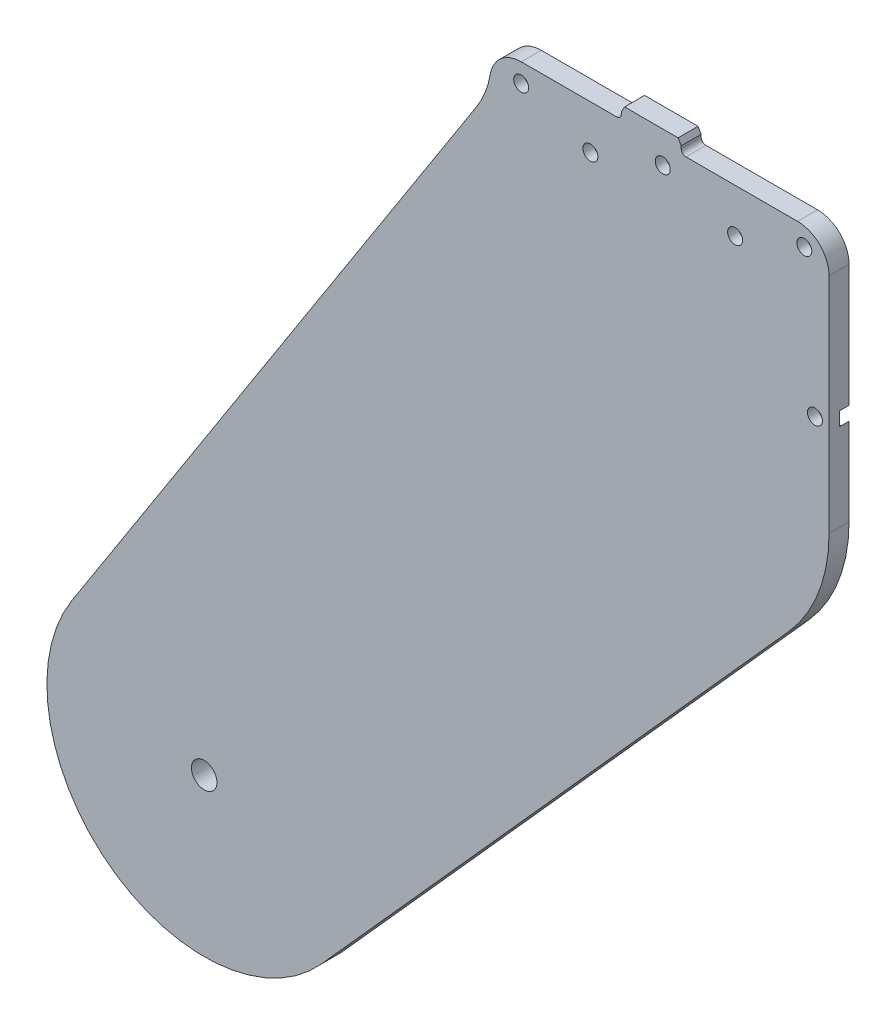
ISO-10303-21;
HEADER;
FILE_DESCRIPTION(('STEP AP214'),'2;1');
FILE_NAME('part.step','',(''),(''),'','','');
FILE_SCHEMA(('AUTOMOTIVE_DESIGN { 1 0 10303 214 1 1 1 1 }'));
ENDSEC;
DATA;
#1=APPLICATION_CONTEXT('core data for automotive mechanical design processes');
#2=APPLICATION_PROTOCOL_DEFINITION('international standard','automotive_design',2000,#1);
#3=PRODUCT_CONTEXT('',#1,'mechanical');
#4=PRODUCT('Part','Part','',(#3));
#5=PRODUCT_RELATED_PRODUCT_CATEGORY('part','',(#4));
#6=PRODUCT_DEFINITION_FORMATION('','',#4);
#7=PRODUCT_DEFINITION_CONTEXT('part definition',#1,'design');
#8=PRODUCT_DEFINITION('design','',#6,#7);
#9=PRODUCT_DEFINITION_SHAPE('','',#8);
#10=(LENGTH_UNIT() NAMED_UNIT(*) SI_UNIT(.MILLI.,.METRE.));
#11=(NAMED_UNIT(*) PLANE_ANGLE_UNIT() SI_UNIT($,.RADIAN.));
#12=(NAMED_UNIT(*) SI_UNIT($,.STERADIAN.) SOLID_ANGLE_UNIT());
#13=UNCERTAINTY_MEASURE_WITH_UNIT(LENGTH_MEASURE(1.E-05),#10,'distance_accuracy_value','');
#14=(GEOMETRIC_REPRESENTATION_CONTEXT(3) GLOBAL_UNCERTAINTY_ASSIGNED_CONTEXT((#13)) GLOBAL_UNIT_ASSIGNED_CONTEXT((#10,
#11,#12)) REPRESENTATION_CONTEXT('',''));
#15=CARTESIAN_POINT('',(0.,0.,0.));
#16=DIRECTION('',(0.,0.,1.));
#17=DIRECTION('',(1.,0.,0.));
#18=AXIS2_PLACEMENT_3D('',#15,#16,#17);
#19=CARTESIAN_POINT('',(0.,0.,0.));
#20=DIRECTION('',(0.,0.,1.));
#21=DIRECTION('',(1.,0.,0.));
#22=AXIS2_PLACEMENT_3D('',#19,#20,#21);
#23=PLANE('',#22);
#24=CARTESIAN_POINT('',(45.75,-46.25,0.));
#25=DIRECTION('',(0.,0.,-1.));
#26=DIRECTION('',(-1.,0.,0.));
#27=AXIS2_PLACEMENT_3D('',#24,#25,#26);
#28=CIRCLE('',#27,4.99999999999999);
#29=CARTESIAN_POINT('',(40.75,-46.25,0.));
#30=VERTEX_POINT('',#29);
#31=EDGE_CURVE('E536',#30,#30,#28,.T.);
#32=ORIENTED_EDGE('',*,*,#31,.F.);
#33=EDGE_LOOP('',(#32));
#34=FACE_BOUND('',#33,.T.);
#35=CARTESIAN_POINT('',(23.75,-54.25,0.));
#36=DIRECTION('',(0.,0.,-1.));
#37=DIRECTION('',(-1.,0.,0.));
#38=AXIS2_PLACEMENT_3D('',#35,#36,#37);
#39=CIRCLE('',#38,4.99999999999999);
#40=CARTESIAN_POINT('',(18.75,-54.25,0.));
#41=VERTEX_POINT('',#40);
#42=EDGE_CURVE('E544',#41,#41,#39,.T.);
#43=ORIENTED_EDGE('',*,*,#42,.F.);
#44=EDGE_LOOP('',(#43));
#45=FACE_BOUND('',#44,.T.);
#46=CARTESIAN_POINT('',(0.750000000000024,-46.25,0.));
#47=DIRECTION('',(0.,0.,-1.));
#48=DIRECTION('',(-1.,0.,0.));
#49=AXIS2_PLACEMENT_3D('',#46,#47,#48);
#50=CIRCLE('',#49,4.99999999999999);
#51=CARTESIAN_POINT('',(-4.24999999999997,-46.25,0.));
#52=VERTEX_POINT('',#51);
#53=EDGE_CURVE('E554',#52,#52,#50,.T.);
#54=ORIENTED_EDGE('',*,*,#53,.F.);
#55=EDGE_LOOP('',(#54));
#56=FACE_BOUND('',#55,.T.);
#57=CARTESIAN_POINT('',(-22.25,-54.25,0.));
#58=DIRECTION('',(0.,0.,-1.));
#59=DIRECTION('',(-1.,0.,0.));
#60=AXIS2_PLACEMENT_3D('',#57,#58,#59);
#61=CIRCLE('',#60,4.99999999999999);
#62=CARTESIAN_POINT('',(-27.25,-54.25,0.));
#63=VERTEX_POINT('',#62);
#64=EDGE_CURVE('E564',#63,#63,#61,.T.);
#65=ORIENTED_EDGE('',*,*,#64,.F.);
#66=EDGE_LOOP('',(#65));
#67=FACE_BOUND('',#66,.T.);
#68=CARTESIAN_POINT('',(-44.25,-46.25,0.));
#69=DIRECTION('',(0.,0.,-1.));
#70=DIRECTION('',(-1.,0.,0.));
#71=AXIS2_PLACEMENT_3D('',#68,#69,#70);
#72=CIRCLE('',#71,4.99999999999999);
#73=CARTESIAN_POINT('',(-49.25,-46.25,0.));
#74=VERTEX_POINT('',#73);
#75=EDGE_CURVE('E574',#74,#74,#72,.T.);
#76=ORIENTED_EDGE('',*,*,#75,.F.);
#77=EDGE_LOOP('',(#76));
#78=FACE_BOUND('',#77,.T.);
#79=CARTESIAN_POINT('',(-145.,-287.,0.));
#80=DIRECTION('',(0.,0.,-1.));
#81=DIRECTION('',(-1.,0.,0.));
#82=AXIS2_PLACEMENT_3D('',#79,#80,#81);
#83=CIRCLE('',#82,4.05);
#84=CARTESIAN_POINT('',(-149.05,-287.,0.));
#85=VERTEX_POINT('',#84);
#86=EDGE_CURVE('E289',#85,#85,#83,.T.);
#87=ORIENTED_EDGE('',*,*,#86,.F.);
#88=EDGE_LOOP('',(#87));
#89=FACE_BOUND('',#88,.T.);
#90=CARTESIAN_POINT('',(49.125,-91.25,0.));
#91=DIRECTION('',(0.,0.,-1.));
#92=DIRECTION('',(-1.,0.,0.));
#93=AXIS2_PLACEMENT_3D('',#90,#91,#92);
#94=CIRCLE('',#93,4.99999999999999);
#95=CARTESIAN_POINT('',(53.625,-93.4294494717704,0.));
#96=VERTEX_POINT('',#95);
#97=CARTESIAN_POINT('',(53.625,-89.0705505282297,0.));
#98=VERTEX_POINT('',#97);
#99=EDGE_CURVE('E166',#96,#98,#94,.T.);
#100=ORIENTED_EDGE('',*,*,#99,.F.);
#101=DIRECTION('',(0.,-1.,0.));
#102=VECTOR('',#101,1.);
#103=CARTESIAN_POINT('',(53.625,0.,0.));
#104=LINE('',#103,#102);
#105=CARTESIAN_POINT('',(53.625,-121.126461822781,0.));
#106=VERTEX_POINT('',#105);
#107=EDGE_CURVE('E186',#96,#106,#104,.T.);
#108=ORIENTED_EDGE('',*,*,#107,.T.);
#109=CARTESIAN_POINT('',(3.62500000000003,-121.126461822781,0.));
#110=DIRECTION('',(0.,0.,1.));
#111=DIRECTION('',(1.,0.,0.));
#112=AXIS2_PLACEMENT_3D('',#109,#110,#111);
#113=CIRCLE('',#112,50.);
#114=CARTESIAN_POINT('',(40.8634243654853,-154.492608600257,0.));
#115=VERTEX_POINT('',#114);
#116=EDGE_CURVE('E204',#106,#115,#113,.F.);
#117=ORIENTED_EDGE('',*,*,#116,.T.);
#118=DIRECTION('',(-0.667322935549508,-0.744768487309706,0.));
#119=VECTOR('',#118,1.);
#120=CARTESIAN_POINT('',(99.4491236750473,-89.1077996444034,0.));
#121=LINE('',#120,#119);
#122=CARTESIAN_POINT('',(-107.761575634515,-320.366146777475,0.));
#123=VERTEX_POINT('',#122);
#124=EDGE_CURVE('E191',#115,#123,#121,.T.);
#125=ORIENTED_EDGE('',*,*,#124,.T.);
#126=CARTESIAN_POINT('',(-145.,-287.,0.));
#127=DIRECTION('',(0.,0.,1.));
#128=DIRECTION('',(1.,0.,0.));
#129=AXIS2_PLACEMENT_3D('',#126,#127,#128);
#130=CIRCLE('',#129,50.);
#131=CARTESIAN_POINT('',(-187.067700458492,-259.975777936551,0.));
#132=VERTEX_POINT('',#131);
#133=EDGE_CURVE('E387',#123,#132,#130,.F.);
#134=ORIENTED_EDGE('',*,*,#133,.T.);
#135=DIRECTION('',(0.540484441268983,0.841354009169836,0.));
#136=VECTOR('',#135,1.);
#137=CARTESIAN_POINT('',(-14.1997812302337,9.12191626915444,0.));
#138=LINE('',#137,#136);
#139=CARTESIAN_POINT('',(-58.384379724905,-59.6587668523979,0.));
#140=VERTEX_POINT('',#139);
#141=EDGE_CURVE('E256',#132,#140,#138,.T.);
#142=ORIENTED_EDGE('',*,*,#141,.T.);
#143=CARTESIAN_POINT('',(-83.625,-43.4442336143284,0.));
#144=DIRECTION('',(0.,0.,1.));
#145=DIRECTION('',(1.,0.,0.));
#146=AXIS2_PLACEMENT_3D('',#143,#144,#145);
#147=CIRCLE('',#146,30.);
#148=CARTESIAN_POINT('',(-54.0624245295541,-48.5485584035821,0.));
#149=VERTEX_POINT('',#148);
#150=EDGE_CURVE('E214',#140,#149,#147,.T.);
#151=ORIENTED_EDGE('',*,*,#150,.T.);
#152=CARTESIAN_POINT('',(-44.2082327060721,-50.25,0.));
#153=DIRECTION('',(0.,0.,1.));
#154=DIRECTION('',(1.,0.,0.));
#155=AXIS2_PLACEMENT_3D('',#152,#153,#154);
#156=CIRCLE('',#155,10.);
#157=CARTESIAN_POINT('',(-44.2082327060721,-40.25,0.));
#158=VERTEX_POINT('',#157);
#159=EDGE_CURVE('E384',#149,#158,#156,.F.);
#160=ORIENTED_EDGE('',*,*,#159,.T.);
#161=DIRECTION('',(-1.,0.,0.));
#162=VECTOR('',#161,1.);
#163=CARTESIAN_POINT('',(0.,-40.25,0.));
#164=LINE('',#163,#162);
#165=CARTESIAN_POINT('',(-13.875,-40.25,0.));
#166=VERTEX_POINT('',#165);
#167=EDGE_CURVE('E257',#166,#158,#164,.T.);
#168=ORIENTED_EDGE('',*,*,#167,.F.);
#169=CARTESIAN_POINT('',(-13.875,-38.75,0.));
#170=DIRECTION('',(0.,0.,1.));
#171=DIRECTION('',(1.,0.,0.));
#172=AXIS2_PLACEMENT_3D('',#169,#170,#171);
#173=CIRCLE('',#172,1.5);
#174=CARTESIAN_POINT('',(-12.375,-38.75,0.));
#175=VERTEX_POINT('',#174);
#176=EDGE_CURVE('E241',#166,#175,#173,.T.);
#177=ORIENTED_EDGE('',*,*,#176,.T.);
#178=DIRECTION('',(0.,1.,0.));
#179=VECTOR('',#178,1.);
#180=CARTESIAN_POINT('',(-12.375,-40.25,0.));
#181=LINE('',#180,#179);
#182=CARTESIAN_POINT('',(-12.375,-37.9820508075688,0.));
#183=VERTEX_POINT('',#182);
#184=EDGE_CURVE('E225',#175,#183,#181,.T.);
#185=ORIENTED_EDGE('',*,*,#184,.T.);
#186=DIRECTION('',(-0.500000000000009,-0.866025403784433,0.));
#187=VECTOR('',#186,1.);
#188=CARTESIAN_POINT('',(-12.375,-37.9820508075688,0.));
#189=LINE('',#188,#187);
#190=CARTESIAN_POINT('',(-11.375,-36.25,0.));
#191=VERTEX_POINT('',#190);
#192=EDGE_CURVE('E302',#183,#191,#189,.F.);
#193=ORIENTED_EDGE('',*,*,#192,.T.);
#194=DIRECTION('',(1.,0.,0.));
#195=VECTOR('',#194,1.);
#196=CARTESIAN_POINT('',(6.62500000000002,-36.25,0.));
#197=LINE('',#196,#195);
#198=CARTESIAN_POINT('',(5.625,-36.25,0.));
#199=VERTEX_POINT('',#198);
#200=EDGE_CURVE('E228',#191,#199,#197,.T.);
#201=ORIENTED_EDGE('',*,*,#200,.T.);
#202=DIRECTION('',(-0.500000000000009,0.866025403784434,0.));
#203=VECTOR('',#202,1.);
#204=CARTESIAN_POINT('',(5.625,-36.25,0.));
#205=LINE('',#204,#203);
#206=CARTESIAN_POINT('',(6.62500000000002,-37.9820508075689,0.));
#207=VERTEX_POINT('',#206);
#208=EDGE_CURVE('E300',#199,#207,#205,.F.);
#209=ORIENTED_EDGE('',*,*,#208,.T.);
#210=DIRECTION('',(0.,-1.,0.));
#211=VECTOR('',#210,1.);
#212=CARTESIAN_POINT('',(6.62500000000003,-40.25,0.));
#213=LINE('',#212,#211);
#214=CARTESIAN_POINT('',(6.62500000000003,-38.75,0.));
#215=VERTEX_POINT('',#214);
#216=EDGE_CURVE('E229',#207,#215,#213,.T.);
#217=ORIENTED_EDGE('',*,*,#216,.T.);
#218=CARTESIAN_POINT('',(8.12500000000003,-38.75,0.));
#219=DIRECTION('',(0.,0.,1.));
#220=DIRECTION('',(1.,0.,0.));
#221=AXIS2_PLACEMENT_3D('',#218,#219,#220);
#222=CIRCLE('',#221,1.5);
#223=CARTESIAN_POINT('',(8.12500000000003,-40.25,0.));
#224=VERTEX_POINT('',#223);
#225=EDGE_CURVE('E245',#215,#224,#222,.T.);
#226=ORIENTED_EDGE('',*,*,#225,.T.);
#227=CARTESIAN_POINT('',(43.625,-40.25,0.));
#228=VERTEX_POINT('',#227);
#229=EDGE_CURVE('E253',#228,#224,#164,.T.);
#230=ORIENTED_EDGE('',*,*,#229,.F.);
#231=CARTESIAN_POINT('',(43.625,-50.25,0.));
#232=DIRECTION('',(0.,0.,1.));
#233=DIRECTION('',(1.,0.,0.));
#234=AXIS2_PLACEMENT_3D('',#231,#232,#233);
#235=CIRCLE('',#234,10.);
#236=CARTESIAN_POINT('',(53.625,-50.25,0.));
#237=VERTEX_POINT('',#236);
#238=EDGE_CURVE('E184',#228,#237,#235,.F.);
#239=ORIENTED_EDGE('',*,*,#238,.T.);
#240=EDGE_CURVE('E180',#237,#98,#104,.T.);
#241=ORIENTED_EDGE('',*,*,#240,.T.);
#242=EDGE_LOOP('',(#100,#108,#117,#125,#134,#142,#151,#160,#168,#177,#185,#193,#201,#209,#217,
#226,#230,#239,#241));
#243=FACE_BOUND('',#242,.T.);
#244=ADVANCED_FACE('F38',(#34,#45,#56,#67,#78,#89,#243),#23,.F.);
#245=CARTESIAN_POINT('',(0.,-40.25,6.35));
#246=DIRECTION('',(0.,-1.,0.));
#247=DIRECTION('',(1.,0.,0.));
#248=AXIS2_PLACEMENT_3D('',#245,#246,#247);
#249=PLANE('',#248);
#250=DIRECTION('',(-1.,0.,0.));
#251=VECTOR('',#250,1.);
#252=CARTESIAN_POINT('',(0.,-40.25,6.35));
#253=LINE('',#252,#251);
#254=CARTESIAN_POINT('',(43.625,-40.25,6.35));
#255=VERTEX_POINT('',#254);
#256=CARTESIAN_POINT('',(8.12500000000003,-40.25,6.35));
#257=VERTEX_POINT('',#256);
#258=EDGE_CURVE('E189',#255,#257,#253,.T.);
#259=ORIENTED_EDGE('',*,*,#258,.F.);
#260=DIRECTION('',(0.,0.,-1.));
#261=VECTOR('',#260,1.);
#262=CARTESIAN_POINT('',(43.625,-40.25,0.));
#263=LINE('',#262,#261);
#264=EDGE_CURVE('E347',#255,#228,#263,.T.);
#265=ORIENTED_EDGE('',*,*,#264,.T.);
#266=ORIENTED_EDGE('',*,*,#229,.T.);
#267=DIRECTION('',(0.,0.,-1.));
#268=VECTOR('',#267,1.);
#269=CARTESIAN_POINT('',(8.12500000000003,-40.25,6.35));
#270=LINE('',#269,#268);
#271=EDGE_CURVE('E238',#224,#257,#270,.F.);
#272=ORIENTED_EDGE('',*,*,#271,.T.);
#273=EDGE_LOOP('',(#259,#265,#266,#272));
#274=FACE_BOUND('',#273,.T.);
#275=ADVANCED_FACE('F399',(#274),#249,.F.);
#276=ORIENTED_EDGE('',*,*,#167,.T.);
#277=DIRECTION('',(0.,0.,1.));
#278=VECTOR('',#277,1.);
#279=CARTESIAN_POINT('',(-44.2082327060721,-40.25,6.35));
#280=LINE('',#279,#278);
#281=CARTESIAN_POINT('',(-44.2082327060721,-40.25,6.35));
#282=VERTEX_POINT('',#281);
#283=EDGE_CURVE('E343',#158,#282,#280,.T.);
#284=ORIENTED_EDGE('',*,*,#283,.T.);
#285=CARTESIAN_POINT('',(-13.875,-40.25,6.35));
#286=VERTEX_POINT('',#285);
#287=EDGE_CURVE('E185',#286,#282,#253,.T.);
#288=ORIENTED_EDGE('',*,*,#287,.F.);
#289=DIRECTION('',(0.,0.,-1.));
#290=VECTOR('',#289,1.);
#291=CARTESIAN_POINT('',(-13.875,-40.25,6.35));
#292=LINE('',#291,#290);
#293=EDGE_CURVE('E235',#286,#166,#292,.T.);
#294=ORIENTED_EDGE('',*,*,#293,.T.);
#295=EDGE_LOOP('',(#276,#284,#288,#294));
#296=FACE_BOUND('',#295,.T.);
#297=ADVANCED_FACE('F396',(#296),#249,.F.);
#298=CARTESIAN_POINT('',(-14.1997812302337,9.12191626915444,6.35));
#299=DIRECTION('',(-0.841354009169835,0.540484441268983,0.));
#300=DIRECTION('',(-0.540484441268983,-0.841354009169835,0.));
#301=AXIS2_PLACEMENT_3D('',#298,#299,#300);
#302=PLANE('',#301);
#303=DIRECTION('',(0.540484441268983,0.841354009169836,0.));
#304=VECTOR('',#303,1.);
#305=CARTESIAN_POINT('',(-14.1997812302337,9.12191626915444,6.35));
#306=LINE('',#305,#304);
#307=CARTESIAN_POINT('',(-187.067700458492,-259.975777936551,6.35));
#308=VERTEX_POINT('',#307);
#309=CARTESIAN_POINT('',(-58.384379724905,-59.6587668523979,6.35));
#310=VERTEX_POINT('',#309);
#311=EDGE_CURVE('E337',#308,#310,#306,.T.);
#312=ORIENTED_EDGE('',*,*,#311,.T.);
#313=DIRECTION('',(0.,0.,-1.));
#314=VECTOR('',#313,1.);
#315=CARTESIAN_POINT('',(-58.384379724905,-59.6587668523979,0.));
#316=LINE('',#315,#314);
#317=EDGE_CURVE('E211',#310,#140,#316,.T.);
#318=ORIENTED_EDGE('',*,*,#317,.T.);
#319=ORIENTED_EDGE('',*,*,#141,.F.);
#320=DIRECTION('',(0.,0.,-1.));
#321=VECTOR('',#320,1.);
#322=CARTESIAN_POINT('',(-187.067700458492,-259.975777936551,6.35));
#323=LINE('',#322,#321);
#324=EDGE_CURVE('E198',#308,#132,#323,.T.);
#325=ORIENTED_EDGE('',*,*,#324,.F.);
#326=EDGE_LOOP('',(#312,#318,#319,#325));
#327=FACE_BOUND('',#326,.T.);
#328=ADVANCED_FACE('F377',(#327),#302,.T.);
#329=CARTESIAN_POINT('',(-145.,-287.,6.35));
#330=DIRECTION('',(0.,0.,-1.));
#331=DIRECTION('',(-1.,0.,0.));
#332=AXIS2_PLACEMENT_3D('',#329,#330,#331);
#333=CYLINDRICAL_SURFACE('',#332,50.);
#334=ORIENTED_EDGE('',*,*,#133,.F.);
#335=DIRECTION('',(0.,0.,-1.));
#336=VECTOR('',#335,1.);
#337=CARTESIAN_POINT('',(-107.761575634515,-320.366146777475,6.35));
#338=LINE('',#337,#336);
#339=CARTESIAN_POINT('',(-107.761575634515,-320.366146777475,6.35));
#340=VERTEX_POINT('',#339);
#341=EDGE_CURVE('E195',#340,#123,#338,.T.);
#342=ORIENTED_EDGE('',*,*,#341,.F.);
#343=CARTESIAN_POINT('',(-145.,-287.,6.35));
#344=DIRECTION('',(0.,0.,1.));
#345=DIRECTION('',(1.,0.,0.));
#346=AXIS2_PLACEMENT_3D('',#343,#344,#345);
#347=CIRCLE('',#346,50.);
#348=EDGE_CURVE('E372',#340,#308,#347,.F.);
#349=ORIENTED_EDGE('',*,*,#348,.T.);
#350=ORIENTED_EDGE('',*,*,#324,.T.);
#351=EDGE_LOOP('',(#334,#342,#349,#350));
#352=FACE_BOUND('',#351,.T.);
#353=ADVANCED_FACE('F388',(#352),#333,.T.);
#354=CARTESIAN_POINT('',(99.4491236750473,-89.1077996444034,6.35));
#355=DIRECTION('',(0.744768487309706,-0.667322935549508,0.));
#356=DIRECTION('',(0.667322935549508,0.744768487309706,0.));
#357=AXIS2_PLACEMENT_3D('',#354,#355,#356);
#358=PLANE('',#357);
#359=ORIENTED_EDGE('',*,*,#124,.F.);
#360=DIRECTION('',(0.,0.,-1.));
#361=VECTOR('',#360,1.);
#362=CARTESIAN_POINT('',(40.8634243654853,-154.492608600257,6.35));
#363=LINE('',#362,#361);
#364=CARTESIAN_POINT('',(40.8634243654853,-154.492608600257,6.35));
#365=VERTEX_POINT('',#364);
#366=EDGE_CURVE('E206',#115,#365,#363,.F.);
#367=ORIENTED_EDGE('',*,*,#366,.T.);
#368=DIRECTION('',(-0.667322935549508,-0.744768487309706,0.));
#369=VECTOR('',#368,1.);
#370=CARTESIAN_POINT('',(99.4491236750473,-89.1077996444034,6.35));
#371=LINE('',#370,#369);
#372=EDGE_CURVE('E367',#365,#340,#371,.T.);
#373=ORIENTED_EDGE('',*,*,#372,.T.);
#374=ORIENTED_EDGE('',*,*,#341,.T.);
#375=EDGE_LOOP('',(#359,#367,#373,#374));
#376=FACE_BOUND('',#375,.T.);
#377=ADVANCED_FACE('F366',(#376),#358,.T.);
#378=CARTESIAN_POINT('',(53.625,0.,6.35));
#379=DIRECTION('',(1.,0.,0.));
#380=DIRECTION('',(0.,1.,0.));
#381=AXIS2_PLACEMENT_3D('',#378,#379,#380);
#382=PLANE('',#381);
#383=DIRECTION('',(0.,0.,-1.));
#384=VECTOR('',#383,1.);
#385=CARTESIAN_POINT('',(53.625,-93.4294494717704,0.));
#386=LINE('',#385,#384);
#387=CARTESIAN_POINT('',(53.625,-93.4294494717704,3.1));
#388=VERTEX_POINT('',#387);
#389=EDGE_CURVE('E11',#388,#96,#386,.T.);
#390=ORIENTED_EDGE('',*,*,#389,.F.);
#391=DIRECTION('',(0.,-1.,0.));
#392=VECTOR('',#391,1.);
#393=CARTESIAN_POINT('',(53.625,0.,3.1));
#394=LINE('',#393,#392);
#395=CARTESIAN_POINT('',(53.625,-89.0705505282297,3.1));
#396=VERTEX_POINT('',#395);
#397=EDGE_CURVE('E46',#396,#388,#394,.T.);
#398=ORIENTED_EDGE('',*,*,#397,.F.);
#399=DIRECTION('',(0.,0.,-1.));
#400=VECTOR('',#399,1.);
#401=CARTESIAN_POINT('',(53.625,-89.0705505282297,0.));
#402=LINE('',#401,#400);
#403=EDGE_CURVE('E169',#98,#396,#402,.F.);
#404=ORIENTED_EDGE('',*,*,#403,.F.);
#405=ORIENTED_EDGE('',*,*,#240,.F.);
#406=DIRECTION('',(0.,0.,-1.));
#407=VECTOR('',#406,1.);
#408=CARTESIAN_POINT('',(53.625,-50.25,6.35));
#409=LINE('',#408,#407);
#410=CARTESIAN_POINT('',(53.625,-50.25,6.35));
#411=VERTEX_POINT('',#410);
#412=EDGE_CURVE('E174',#237,#411,#409,.F.);
#413=ORIENTED_EDGE('',*,*,#412,.T.);
#414=DIRECTION('',(0.,-1.,0.));
#415=VECTOR('',#414,1.);
#416=CARTESIAN_POINT('',(53.625,0.,6.35));
#417=LINE('',#416,#415);
#418=CARTESIAN_POINT('',(53.625,-121.126461822781,6.35));
#419=VERTEX_POINT('',#418);
#420=EDGE_CURVE('E199',#411,#419,#417,.T.);
#421=ORIENTED_EDGE('',*,*,#420,.T.);
#422=DIRECTION('',(0.,0.,-1.));
#423=VECTOR('',#422,1.);
#424=CARTESIAN_POINT('',(53.625,-121.126461822781,6.35));
#425=LINE('',#424,#423);
#426=EDGE_CURVE('E201',#419,#106,#425,.T.);
#427=ORIENTED_EDGE('',*,*,#426,.T.);
#428=ORIENTED_EDGE('',*,*,#107,.F.);
#429=EDGE_LOOP('',(#390,#398,#404,#405,#413,#421,#427,#428));
#430=FACE_BOUND('',#429,.T.);
#431=ADVANCED_FACE('F179',(#430),#382,.T.);
#432=CARTESIAN_POINT('',(0.,0.,6.35));
#433=DIRECTION('',(0.,0.,1.));
#434=DIRECTION('',(1.,0.,0.));
#435=AXIS2_PLACEMENT_3D('',#432,#433,#434);
#436=PLANE('',#435);
#437=CARTESIAN_POINT('',(45.75,-46.25,6.35));
#438=DIRECTION('',(0.,0.,-1.));
#439=DIRECTION('',(-1.,0.,0.));
#440=AXIS2_PLACEMENT_3D('',#437,#438,#439);
#441=CIRCLE('',#440,2.375);
#442=CARTESIAN_POINT('',(43.375,-46.25,6.35));
#443=VERTEX_POINT('',#442);
#444=EDGE_CURVE('E424',#443,#443,#441,.T.);
#445=ORIENTED_EDGE('',*,*,#444,.T.);
#446=EDGE_LOOP('',(#445));
#447=FACE_BOUND('',#446,.T.);
#448=CARTESIAN_POINT('',(23.75,-54.25,6.35));
#449=DIRECTION('',(0.,0.,-1.));
#450=DIRECTION('',(-1.,0.,0.));
#451=AXIS2_PLACEMENT_3D('',#448,#449,#450);
#452=CIRCLE('',#451,2.375);
#453=CARTESIAN_POINT('',(21.375,-54.25,6.35));
#454=VERTEX_POINT('',#453);
#455=EDGE_CURVE('E428',#454,#454,#452,.T.);
#456=ORIENTED_EDGE('',*,*,#455,.T.);
#457=EDGE_LOOP('',(#456));
#458=FACE_BOUND('',#457,.T.);
#459=CARTESIAN_POINT('',(0.750000000000024,-46.25,6.35));
#460=DIRECTION('',(0.,0.,-1.));
#461=DIRECTION('',(-1.,0.,0.));
#462=AXIS2_PLACEMENT_3D('',#459,#460,#461);
#463=CIRCLE('',#462,2.375);
#464=CARTESIAN_POINT('',(-1.62499999999997,-46.25,6.35));
#465=VERTEX_POINT('',#464);
#466=EDGE_CURVE('E432',#465,#465,#463,.T.);
#467=ORIENTED_EDGE('',*,*,#466,.T.);
#468=EDGE_LOOP('',(#467));
#469=FACE_BOUND('',#468,.T.);
#470=CARTESIAN_POINT('',(-22.25,-54.25,6.35));
#471=DIRECTION('',(0.,0.,-1.));
#472=DIRECTION('',(-1.,0.,0.));
#473=AXIS2_PLACEMENT_3D('',#470,#471,#472);
#474=CIRCLE('',#473,2.375);
#475=CARTESIAN_POINT('',(-24.625,-54.25,6.35));
#476=VERTEX_POINT('',#475);
#477=EDGE_CURVE('E436',#476,#476,#474,.T.);
#478=ORIENTED_EDGE('',*,*,#477,.T.);
#479=EDGE_LOOP('',(#478));
#480=FACE_BOUND('',#479,.T.);
#481=CARTESIAN_POINT('',(-44.25,-46.25,6.35));
#482=DIRECTION('',(0.,0.,-1.));
#483=DIRECTION('',(-1.,0.,0.));
#484=AXIS2_PLACEMENT_3D('',#481,#482,#483);
#485=CIRCLE('',#484,2.375);
#486=CARTESIAN_POINT('',(-46.625,-46.25,6.35));
#487=VERTEX_POINT('',#486);
#488=EDGE_CURVE('E355',#487,#487,#485,.T.);
#489=ORIENTED_EDGE('',*,*,#488,.T.);
#490=EDGE_LOOP('',(#489));
#491=FACE_BOUND('',#490,.T.);
#492=CARTESIAN_POINT('',(49.125,-91.25,6.35));
#493=DIRECTION('',(0.,0.,-1.));
#494=DIRECTION('',(-1.,0.,0.));
#495=AXIS2_PLACEMENT_3D('',#492,#493,#494);
#496=CIRCLE('',#495,2.375);
#497=CARTESIAN_POINT('',(46.75,-91.25,6.35));
#498=VERTEX_POINT('',#497);
#499=EDGE_CURVE('E299',#498,#498,#496,.T.);
#500=ORIENTED_EDGE('',*,*,#499,.T.);
#501=EDGE_LOOP('',(#500));
#502=FACE_BOUND('',#501,.T.);
#503=CARTESIAN_POINT('',(-145.,-287.,6.35));
#504=DIRECTION('',(0.,0.,-1.));
#505=DIRECTION('',(-1.,0.,0.));
#506=AXIS2_PLACEMENT_3D('',#503,#504,#505);
#507=CIRCLE('',#506,4.05);
#508=CARTESIAN_POINT('',(-149.05,-287.,6.35));
#509=VERTEX_POINT('',#508);
#510=EDGE_CURVE('E266',#509,#509,#507,.T.);
#511=ORIENTED_EDGE('',*,*,#510,.T.);
#512=EDGE_LOOP('',(#511));
#513=FACE_BOUND('',#512,.T.);
#514=ORIENTED_EDGE('',*,*,#287,.T.);
#515=CARTESIAN_POINT('',(-44.2082327060721,-50.25,6.35));
#516=DIRECTION('',(0.,0.,1.));
#517=DIRECTION('',(1.,0.,0.));
#518=AXIS2_PLACEMENT_3D('',#515,#516,#517);
#519=CIRCLE('',#518,10.);
#520=CARTESIAN_POINT('',(-54.0624245295541,-48.5485584035821,6.35));
#521=VERTEX_POINT('',#520);
#522=EDGE_CURVE('E345',#282,#521,#519,.T.);
#523=ORIENTED_EDGE('',*,*,#522,.T.);
#524=CARTESIAN_POINT('',(-83.625,-43.4442336143284,6.35));
#525=DIRECTION('',(0.,0.,1.));
#526=DIRECTION('',(1.,0.,0.));
#527=AXIS2_PLACEMENT_3D('',#524,#525,#526);
#528=CIRCLE('',#527,30.);
#529=EDGE_CURVE('E217',#521,#310,#528,.F.);
#530=ORIENTED_EDGE('',*,*,#529,.T.);
#531=ORIENTED_EDGE('',*,*,#311,.F.);
#532=ORIENTED_EDGE('',*,*,#348,.F.);
#533=ORIENTED_EDGE('',*,*,#372,.F.);
#534=CARTESIAN_POINT('',(3.62500000000003,-121.126461822781,6.35));
#535=DIRECTION('',(0.,0.,1.));
#536=DIRECTION('',(1.,0.,0.));
#537=AXIS2_PLACEMENT_3D('',#534,#535,#536);
#538=CIRCLE('',#537,50.);
#539=EDGE_CURVE('E208',#365,#419,#538,.T.);
#540=ORIENTED_EDGE('',*,*,#539,.T.);
#541=ORIENTED_EDGE('',*,*,#420,.F.);
#542=CARTESIAN_POINT('',(43.625,-50.25,6.35));
#543=DIRECTION('',(0.,0.,1.));
#544=DIRECTION('',(1.,0.,0.));
#545=AXIS2_PLACEMENT_3D('',#542,#543,#544);
#546=CIRCLE('',#545,10.);
#547=EDGE_CURVE('E59',#411,#255,#546,.T.);
#548=ORIENTED_EDGE('',*,*,#547,.T.);
#549=ORIENTED_EDGE('',*,*,#258,.T.);
#550=CARTESIAN_POINT('',(8.12500000000003,-38.75,6.35));
#551=DIRECTION('',(0.,0.,1.));
#552=DIRECTION('',(1.,0.,0.));
#553=AXIS2_PLACEMENT_3D('',#550,#551,#552);
#554=CIRCLE('',#553,1.5);
#555=CARTESIAN_POINT('',(6.62500000000003,-38.75,6.35));
#556=VERTEX_POINT('',#555);
#557=EDGE_CURVE('E248',#257,#556,#554,.F.);
#558=ORIENTED_EDGE('',*,*,#557,.T.);
#559=DIRECTION('',(0.,-1.,0.));
#560=VECTOR('',#559,1.);
#561=CARTESIAN_POINT('',(6.62500000000003,-40.25,6.35));
#562=LINE('',#561,#560);
#563=CARTESIAN_POINT('',(6.62500000000003,-37.9820508075689,6.35));
#564=VERTEX_POINT('',#563);
#565=EDGE_CURVE('E287',#564,#556,#562,.T.);
#566=ORIENTED_EDGE('',*,*,#565,.F.);
#567=DIRECTION('',(0.500000000000009,-0.866025403784434,0.));
#568=VECTOR('',#567,1.);
#569=CARTESIAN_POINT('',(-11.4779604435932,-6.62680355185656,6.35));
#570=LINE('',#569,#568);
#571=CARTESIAN_POINT('',(5.625,-36.25,6.35));
#572=VERTEX_POINT('',#571);
#573=EDGE_CURVE('E282',#564,#572,#570,.F.);
#574=ORIENTED_EDGE('',*,*,#573,.T.);
#575=DIRECTION('',(1.,0.,0.));
#576=VECTOR('',#575,1.);
#577=CARTESIAN_POINT('',(6.62500000000002,-36.25,6.35));
#578=LINE('',#577,#576);
#579=CARTESIAN_POINT('',(-11.375,-36.25,6.35));
#580=VERTEX_POINT('',#579);
#581=EDGE_CURVE('E290',#580,#572,#578,.T.);
#582=ORIENTED_EDGE('',*,*,#581,.F.);
#583=DIRECTION('',(0.500000000000009,0.866025403784433,0.));
#584=VECTOR('',#583,1.);
#585=CARTESIAN_POINT('',(7.16546044359326,-4.13698051597629,6.35));
#586=LINE('',#585,#584);
#587=CARTESIAN_POINT('',(-12.375,-37.9820508075689,6.35));
#588=VERTEX_POINT('',#587);
#589=EDGE_CURVE('E275',#580,#588,#586,.F.);
#590=ORIENTED_EDGE('',*,*,#589,.T.);
#591=DIRECTION('',(0.,1.,0.));
#592=VECTOR('',#591,1.);
#593=CARTESIAN_POINT('',(-12.375,-40.25,6.35));
#594=LINE('',#593,#592);
#595=CARTESIAN_POINT('',(-12.375,-38.75,6.35));
#596=VERTEX_POINT('',#595);
#597=EDGE_CURVE('E230',#596,#588,#594,.T.);
#598=ORIENTED_EDGE('',*,*,#597,.F.);
#599=CARTESIAN_POINT('',(-13.875,-38.75,6.35));
#600=DIRECTION('',(0.,0.,1.));
#601=DIRECTION('',(1.,0.,0.));
#602=AXIS2_PLACEMENT_3D('',#599,#600,#601);
#603=CIRCLE('',#602,1.5);
#604=EDGE_CURVE('E243',#596,#286,#603,.F.);
#605=ORIENTED_EDGE('',*,*,#604,.T.);
#606=EDGE_LOOP('',(#514,#523,#530,#531,#532,#533,#540,#541,#548,#549,#558,#566,#574,#582,#590,
#598,#605));
#607=FACE_BOUND('',#606,.T.);
#608=ADVANCED_FACE('F316',(#447,#458,#469,#480,#491,#502,#513,#607),#436,.T.);
#609=CARTESIAN_POINT('',(3.62500000000003,-121.126461822781,6.35));
#610=DIRECTION('',(0.,0.,-1.));
#611=DIRECTION('',(-1.,0.,0.));
#612=AXIS2_PLACEMENT_3D('',#609,#610,#611);
#613=CYLINDRICAL_SURFACE('',#612,50.);
#614=ORIENTED_EDGE('',*,*,#539,.F.);
#615=ORIENTED_EDGE('',*,*,#366,.F.);
#616=ORIENTED_EDGE('',*,*,#116,.F.);
#617=ORIENTED_EDGE('',*,*,#426,.F.);
#618=EDGE_LOOP('',(#614,#615,#616,#617));
#619=FACE_BOUND('',#618,.T.);
#620=ADVANCED_FACE('F363',(#619),#613,.T.);
#621=CARTESIAN_POINT('',(-83.625,-43.4442336143284,6.35));
#622=DIRECTION('',(0.,0.,1.));
#623=DIRECTION('',(1.,0.,0.));
#624=AXIS2_PLACEMENT_3D('',#621,#622,#623);
#625=CYLINDRICAL_SURFACE('',#624,30.);
#626=ORIENTED_EDGE('',*,*,#529,.F.);
#627=DIRECTION('',(0.,0.,1.));
#628=VECTOR('',#627,1.);
#629=CARTESIAN_POINT('',(-54.0624245295541,-48.5485584035821,6.35));
#630=LINE('',#629,#628);
#631=EDGE_CURVE('E250',#521,#149,#630,.F.);
#632=ORIENTED_EDGE('',*,*,#631,.T.);
#633=ORIENTED_EDGE('',*,*,#150,.F.);
#634=ORIENTED_EDGE('',*,*,#317,.F.);
#635=EDGE_LOOP('',(#626,#632,#633,#634));
#636=FACE_BOUND('',#635,.T.);
#637=ADVANCED_FACE('F382',(#636),#625,.F.);
#638=CARTESIAN_POINT('',(-145.,-287.,6.35));
#639=DIRECTION('',(0.,0.,-1.));
#640=DIRECTION('',(-1.,0.,0.));
#641=AXIS2_PLACEMENT_3D('',#638,#639,#640);
#642=CYLINDRICAL_SURFACE('',#641,4.05);
#643=ORIENTED_EDGE('',*,*,#510,.F.);
#644=EDGE_LOOP('',(#643));
#645=FACE_BOUND('',#644,.T.);
#646=ORIENTED_EDGE('',*,*,#86,.T.);
#647=EDGE_LOOP('',(#646));
#648=FACE_BOUND('',#647,.T.);
#649=ADVANCED_FACE('F445',(#645,#648),#642,.F.);
#650=CARTESIAN_POINT('',(-12.375,-40.25,25.7664878389476));
#651=DIRECTION('',(-1.,0.,0.));
#652=DIRECTION('',(0.,-1.,0.));
#653=AXIS2_PLACEMENT_3D('',#650,#651,#652);
#654=PLANE('',#653);
#655=ORIENTED_EDGE('',*,*,#184,.F.);
#656=DIRECTION('',(0.,0.,-1.));
#657=VECTOR('',#656,1.);
#658=CARTESIAN_POINT('',(-12.375,-38.75,25.7664878389476));
#659=LINE('',#658,#657);
#660=EDGE_CURVE('E232',#175,#596,#659,.F.);
#661=ORIENTED_EDGE('',*,*,#660,.T.);
#662=ORIENTED_EDGE('',*,*,#597,.T.);
#663=DIRECTION('',(0.,0.,-1.));
#664=VECTOR('',#663,1.);
#665=CARTESIAN_POINT('',(-12.375,-37.9820508075688,25.7664878389476));
#666=LINE('',#665,#664);
#667=EDGE_CURVE('E219',#588,#183,#666,.T.);
#668=ORIENTED_EDGE('',*,*,#667,.T.);
#669=EDGE_LOOP('',(#655,#661,#662,#668));
#670=FACE_BOUND('',#669,.T.);
#671=ADVANCED_FACE('F325',(#670),#654,.T.);
#672=CARTESIAN_POINT('',(6.62500000000002,-36.25,25.7664878389476));
#673=DIRECTION('',(0.,1.,0.));
#674=DIRECTION('',(0.,0.,1.));
#675=AXIS2_PLACEMENT_3D('',#672,#673,#674);
#676=PLANE('',#675);
#677=ORIENTED_EDGE('',*,*,#200,.F.);
#678=DIRECTION('',(0.,0.,1.));
#679=VECTOR('',#678,1.);
#680=CARTESIAN_POINT('',(-11.375,-36.25,25.7664878389476));
#681=LINE('',#680,#679);
#682=EDGE_CURVE('E286',#191,#580,#681,.T.);
#683=ORIENTED_EDGE('',*,*,#682,.T.);
#684=ORIENTED_EDGE('',*,*,#581,.T.);
#685=DIRECTION('',(0.,0.,-1.));
#686=VECTOR('',#685,1.);
#687=CARTESIAN_POINT('',(5.625,-36.25,25.7664878389476));
#688=LINE('',#687,#686);
#689=EDGE_CURVE('E303',#572,#199,#688,.T.);
#690=ORIENTED_EDGE('',*,*,#689,.T.);
#691=EDGE_LOOP('',(#677,#683,#684,#690));
#692=FACE_BOUND('',#691,.T.);
#693=ADVANCED_FACE('F312',(#692),#676,.T.);
#694=CARTESIAN_POINT('',(6.62500000000003,-40.25,25.7664878389476));
#695=DIRECTION('',(1.,0.,0.));
#696=DIRECTION('',(0.,1.,0.));
#697=AXIS2_PLACEMENT_3D('',#694,#695,#696);
#698=PLANE('',#697);
#699=ORIENTED_EDGE('',*,*,#565,.T.);
#700=DIRECTION('',(0.,0.,-1.));
#701=VECTOR('',#700,1.);
#702=CARTESIAN_POINT('',(6.62500000000003,-38.75,25.7664878389476));
#703=LINE('',#702,#701);
#704=EDGE_CURVE('E234',#556,#215,#703,.T.);
#705=ORIENTED_EDGE('',*,*,#704,.T.);
#706=ORIENTED_EDGE('',*,*,#216,.F.);
#707=DIRECTION('',(0.,0.,1.));
#708=VECTOR('',#707,1.);
#709=CARTESIAN_POINT('',(6.62500000000002,-37.9820508075689,25.7664878389476));
#710=LINE('',#709,#708);
#711=EDGE_CURVE('E270',#207,#564,#710,.T.);
#712=ORIENTED_EDGE('',*,*,#711,.T.);
#713=EDGE_LOOP('',(#699,#705,#706,#712));
#714=FACE_BOUND('',#713,.T.);
#715=ADVANCED_FACE('F459',(#714),#698,.T.);
#716=CARTESIAN_POINT('',(-12.375,-37.9820508075688,25.7664878389476));
#717=DIRECTION('',(0.866025403784433,-0.500000000000009,0.));
#718=DIRECTION('',(0.,0.,-1.));
#719=AXIS2_PLACEMENT_3D('',#716,#717,#718);
#720=PLANE('',#719);
#721=ORIENTED_EDGE('',*,*,#589,.F.);
#722=ORIENTED_EDGE('',*,*,#682,.F.);
#723=ORIENTED_EDGE('',*,*,#192,.F.);
#724=ORIENTED_EDGE('',*,*,#667,.F.);
#725=EDGE_LOOP('',(#721,#722,#723,#724));
#726=FACE_BOUND('',#725,.T.);
#727=ADVANCED_FACE('F321',(#726),#720,.F.);
#728=CARTESIAN_POINT('',(5.625,-36.25,25.7664878389476));
#729=DIRECTION('',(-0.866025403784433,-0.500000000000009,0.));
#730=DIRECTION('',(0.,0.,-1.));
#731=AXIS2_PLACEMENT_3D('',#728,#729,#730);
#732=PLANE('',#731);
#733=ORIENTED_EDGE('',*,*,#573,.F.);
#734=ORIENTED_EDGE('',*,*,#711,.F.);
#735=ORIENTED_EDGE('',*,*,#208,.F.);
#736=ORIENTED_EDGE('',*,*,#689,.F.);
#737=EDGE_LOOP('',(#733,#734,#735,#736));
#738=FACE_BOUND('',#737,.T.);
#739=ADVANCED_FACE('F714',(#738),#732,.F.);
#740=CARTESIAN_POINT('',(-13.875,-38.75,6.35));
#741=DIRECTION('',(0.,0.,-1.));
#742=DIRECTION('',(-1.,0.,0.));
#743=AXIS2_PLACEMENT_3D('',#740,#741,#742);
#744=CYLINDRICAL_SURFACE('',#743,1.5);
#745=ORIENTED_EDGE('',*,*,#604,.F.);
#746=ORIENTED_EDGE('',*,*,#660,.F.);
#747=ORIENTED_EDGE('',*,*,#176,.F.);
#748=ORIENTED_EDGE('',*,*,#293,.F.);
#749=EDGE_LOOP('',(#745,#746,#747,#748));
#750=FACE_BOUND('',#749,.T.);
#751=ADVANCED_FACE('F705',(#750),#744,.F.);
#752=CARTESIAN_POINT('',(8.12500000000003,-38.75,25.7664878389476));
#753=DIRECTION('',(0.,0.,-1.));
#754=DIRECTION('',(-1.,0.,0.));
#755=AXIS2_PLACEMENT_3D('',#752,#753,#754);
#756=CYLINDRICAL_SURFACE('',#755,1.5);
#757=ORIENTED_EDGE('',*,*,#557,.F.);
#758=ORIENTED_EDGE('',*,*,#271,.F.);
#759=ORIENTED_EDGE('',*,*,#225,.F.);
#760=ORIENTED_EDGE('',*,*,#704,.F.);
#761=EDGE_LOOP('',(#757,#758,#759,#760));
#762=FACE_BOUND('',#761,.T.);
#763=ADVANCED_FACE('F697',(#762),#756,.F.);
#764=CARTESIAN_POINT('',(-44.2082327060721,-50.25,6.35));
#765=DIRECTION('',(0.,0.,1.));
#766=DIRECTION('',(1.,0.,0.));
#767=AXIS2_PLACEMENT_3D('',#764,#765,#766);
#768=CYLINDRICAL_SURFACE('',#767,10.);
#769=ORIENTED_EDGE('',*,*,#522,.F.);
#770=ORIENTED_EDGE('',*,*,#283,.F.);
#771=ORIENTED_EDGE('',*,*,#159,.F.);
#772=ORIENTED_EDGE('',*,*,#631,.F.);
#773=EDGE_LOOP('',(#769,#770,#771,#772));
#774=FACE_BOUND('',#773,.T.);
#775=ADVANCED_FACE('F690',(#774),#768,.T.);
#776=CARTESIAN_POINT('',(43.625,-50.25,6.35));
#777=DIRECTION('',(0.,0.,1.));
#778=DIRECTION('',(1.,0.,0.));
#779=AXIS2_PLACEMENT_3D('',#776,#777,#778);
#780=CYLINDRICAL_SURFACE('',#779,10.);
#781=ORIENTED_EDGE('',*,*,#547,.F.);
#782=ORIENTED_EDGE('',*,*,#412,.F.);
#783=ORIENTED_EDGE('',*,*,#238,.F.);
#784=ORIENTED_EDGE('',*,*,#264,.F.);
#785=EDGE_LOOP('',(#781,#782,#783,#784));
#786=FACE_BOUND('',#785,.T.);
#787=ADVANCED_FACE('F40',(#786),#780,.T.);
#788=CARTESIAN_POINT('',(49.125,-91.25,0.));
#789=DIRECTION('',(0.,0.,-1.));
#790=DIRECTION('',(-1.,0.,0.));
#791=AXIS2_PLACEMENT_3D('',#788,#789,#790);
#792=CYLINDRICAL_SURFACE('',#791,2.37500000000001);
#793=ORIENTED_EDGE('',*,*,#499,.F.);
#794=EDGE_LOOP('',(#793));
#795=FACE_BOUND('',#794,.T.);
#796=CARTESIAN_POINT('',(49.125,-91.25,3.1));
#797=DIRECTION('',(0.,0.,-1.));
#798=DIRECTION('',(-1.,0.,0.));
#799=AXIS2_PLACEMENT_3D('',#796,#797,#798);
#800=CIRCLE('',#799,2.37500000000002);
#801=CARTESIAN_POINT('',(46.75,-91.25,3.1));
#802=VERTEX_POINT('',#801);
#803=EDGE_CURVE('E354',#802,#802,#800,.T.);
#804=ORIENTED_EDGE('',*,*,#803,.T.);
#805=EDGE_LOOP('',(#804));
#806=FACE_BOUND('',#805,.T.);
#807=ADVANCED_FACE('F462',(#795,#806),#792,.F.);
#808=CARTESIAN_POINT('',(51.5000000000001,-91.25,3.1));
#809=DIRECTION('',(0.,0.,1.));
#810=DIRECTION('',(1.,0.,0.));
#811=AXIS2_PLACEMENT_3D('',#808,#809,#810);
#812=PLANE('',#811);
#813=ORIENTED_EDGE('',*,*,#397,.T.);
#814=CARTESIAN_POINT('',(49.125,-91.25,3.1));
#815=DIRECTION('',(0.,0.,-1.));
#816=DIRECTION('',(-1.,0.,0.));
#817=AXIS2_PLACEMENT_3D('',#814,#815,#816);
#818=CIRCLE('',#817,4.99999999999999);
#819=EDGE_CURVE('E353',#388,#396,#818,.T.);
#820=ORIENTED_EDGE('',*,*,#819,.T.);
#821=EDGE_LOOP('',(#813,#820));
#822=FACE_BOUND('',#821,.T.);
#823=ORIENTED_EDGE('',*,*,#803,.F.);
#824=EDGE_LOOP('',(#823));
#825=FACE_BOUND('',#824,.T.);
#826=ADVANCED_FACE('F351',(#822,#825),#812,.F.);
#827=CARTESIAN_POINT('',(49.125,-91.25,0.));
#828=DIRECTION('',(0.,0.,-1.));
#829=DIRECTION('',(-1.,0.,0.));
#830=AXIS2_PLACEMENT_3D('',#827,#828,#829);
#831=CYLINDRICAL_SURFACE('',#830,4.99999999999999);
#832=ORIENTED_EDGE('',*,*,#389,.T.);
#833=ORIENTED_EDGE('',*,*,#99,.T.);
#834=ORIENTED_EDGE('',*,*,#403,.T.);
#835=ORIENTED_EDGE('',*,*,#819,.F.);
#836=EDGE_LOOP('',(#832,#833,#834,#835));
#837=FACE_BOUND('',#836,.T.);
#838=ADVANCED_FACE('F168',(#837),#831,.F.);
#839=CARTESIAN_POINT('',(-44.25,-46.25,0.));
#840=DIRECTION('',(0.,0.,-1.));
#841=DIRECTION('',(-1.,0.,0.));
#842=AXIS2_PLACEMENT_3D('',#839,#840,#841);
#843=CYLINDRICAL_SURFACE('',#842,2.37500000000001);
#844=ORIENTED_EDGE('',*,*,#488,.F.);
#845=EDGE_LOOP('',(#844));
#846=FACE_BOUND('',#845,.T.);
#847=CARTESIAN_POINT('',(-44.25,-46.25,3.1));
#848=DIRECTION('',(0.,0.,-1.));
#849=DIRECTION('',(-1.,0.,0.));
#850=AXIS2_PLACEMENT_3D('',#847,#848,#849);
#851=CIRCLE('',#850,2.37500000000002);
#852=CARTESIAN_POINT('',(-46.625,-46.25,3.1));
#853=VERTEX_POINT('',#852);
#854=EDGE_CURVE('E580',#853,#853,#851,.T.);
#855=ORIENTED_EDGE('',*,*,#854,.T.);
#856=EDGE_LOOP('',(#855));
#857=FACE_BOUND('',#856,.T.);
#858=ADVANCED_FACE('F470',(#846,#857),#843,.F.);
#859=CARTESIAN_POINT('',(-41.875,-46.25,3.1));
#860=DIRECTION('',(0.,0.,1.));
#861=DIRECTION('',(1.,0.,0.));
#862=AXIS2_PLACEMENT_3D('',#859,#860,#861);
#863=PLANE('',#862);
#864=ORIENTED_EDGE('',*,*,#854,.F.);
#865=EDGE_LOOP('',(#864));
#866=FACE_BOUND('',#865,.T.);
#867=CARTESIAN_POINT('',(-44.25,-46.25,3.1));
#868=DIRECTION('',(0.,0.,-1.));
#869=DIRECTION('',(-1.,0.,0.));
#870=AXIS2_PLACEMENT_3D('',#867,#868,#869);
#871=CIRCLE('',#870,4.99999999999999);
#872=CARTESIAN_POINT('',(-49.25,-46.25,3.1));
#873=VERTEX_POINT('',#872);
#874=EDGE_CURVE('E577',#873,#873,#871,.T.);
#875=ORIENTED_EDGE('',*,*,#874,.T.);
#876=EDGE_LOOP('',(#875));
#877=FACE_BOUND('',#876,.T.);
#878=ADVANCED_FACE('F473',(#866,#877),#863,.F.);
#879=CARTESIAN_POINT('',(-44.25,-46.25,0.));
#880=DIRECTION('',(0.,0.,-1.));
#881=DIRECTION('',(-1.,0.,0.));
#882=AXIS2_PLACEMENT_3D('',#879,#880,#881);
#883=CYLINDRICAL_SURFACE('',#882,4.99999999999999);
#884=ORIENTED_EDGE('',*,*,#874,.F.);
#885=EDGE_LOOP('',(#884));
#886=FACE_BOUND('',#885,.T.);
#887=ORIENTED_EDGE('',*,*,#75,.T.);
#888=EDGE_LOOP('',(#887));
#889=FACE_BOUND('',#888,.T.);
#890=ADVANCED_FACE('F477',(#886,#889),#883,.F.);
#891=CARTESIAN_POINT('',(-22.25,-54.25,0.));
#892=DIRECTION('',(0.,0.,-1.));
#893=DIRECTION('',(-1.,0.,0.));
#894=AXIS2_PLACEMENT_3D('',#891,#892,#893);
#895=CYLINDRICAL_SURFACE('',#894,2.37500000000001);
#896=ORIENTED_EDGE('',*,*,#477,.F.);
#897=EDGE_LOOP('',(#896));
#898=FACE_BOUND('',#897,.T.);
#899=CARTESIAN_POINT('',(-22.25,-54.25,3.1));
#900=DIRECTION('',(0.,0.,-1.));
#901=DIRECTION('',(-1.,0.,0.));
#902=AXIS2_PLACEMENT_3D('',#899,#900,#901);
#903=CIRCLE('',#902,2.37500000000001);
#904=CARTESIAN_POINT('',(-24.625,-54.25,3.1));
#905=VERTEX_POINT('',#904);
#906=EDGE_CURVE('E570',#905,#905,#903,.T.);
#907=ORIENTED_EDGE('',*,*,#906,.T.);
#908=EDGE_LOOP('',(#907));
#909=FACE_BOUND('',#908,.T.);
#910=ADVANCED_FACE('F481',(#898,#909),#895,.F.);
#911=CARTESIAN_POINT('',(-19.875,-54.25,3.1));
#912=DIRECTION('',(0.,0.,1.));
#913=DIRECTION('',(1.,0.,0.));
#914=AXIS2_PLACEMENT_3D('',#911,#912,#913);
#915=PLANE('',#914);
#916=ORIENTED_EDGE('',*,*,#906,.F.);
#917=EDGE_LOOP('',(#916));
#918=FACE_BOUND('',#917,.T.);
#919=CARTESIAN_POINT('',(-22.25,-54.25,3.1));
#920=DIRECTION('',(0.,0.,-1.));
#921=DIRECTION('',(-1.,0.,0.));
#922=AXIS2_PLACEMENT_3D('',#919,#920,#921);
#923=CIRCLE('',#922,4.99999999999999);
#924=CARTESIAN_POINT('',(-27.25,-54.25,3.1));
#925=VERTEX_POINT('',#924);
#926=EDGE_CURVE('E567',#925,#925,#923,.T.);
#927=ORIENTED_EDGE('',*,*,#926,.T.);
#928=EDGE_LOOP('',(#927));
#929=FACE_BOUND('',#928,.T.);
#930=ADVANCED_FACE('F485',(#918,#929),#915,.F.);
#931=CARTESIAN_POINT('',(-22.25,-54.25,0.));
#932=DIRECTION('',(0.,0.,-1.));
#933=DIRECTION('',(-1.,0.,0.));
#934=AXIS2_PLACEMENT_3D('',#931,#932,#933);
#935=CYLINDRICAL_SURFACE('',#934,4.99999999999999);
#936=ORIENTED_EDGE('',*,*,#926,.F.);
#937=EDGE_LOOP('',(#936));
#938=FACE_BOUND('',#937,.T.);
#939=ORIENTED_EDGE('',*,*,#64,.T.);
#940=EDGE_LOOP('',(#939));
#941=FACE_BOUND('',#940,.T.);
#942=ADVANCED_FACE('F489',(#938,#941),#935,.F.);
#943=CARTESIAN_POINT('',(0.750000000000024,-46.25,0.));
#944=DIRECTION('',(0.,0.,-1.));
#945=DIRECTION('',(-1.,0.,0.));
#946=AXIS2_PLACEMENT_3D('',#943,#944,#945);
#947=CYLINDRICAL_SURFACE('',#946,2.37500000000001);
#948=ORIENTED_EDGE('',*,*,#466,.F.);
#949=EDGE_LOOP('',(#948));
#950=FACE_BOUND('',#949,.T.);
#951=CARTESIAN_POINT('',(0.750000000000024,-46.25,3.1));
#952=DIRECTION('',(0.,0.,-1.));
#953=DIRECTION('',(-1.,0.,0.));
#954=AXIS2_PLACEMENT_3D('',#951,#952,#953);
#955=CIRCLE('',#954,2.37500000000001);
#956=CARTESIAN_POINT('',(-1.62499999999999,-46.25,3.1));
#957=VERTEX_POINT('',#956);
#958=EDGE_CURVE('E560',#957,#957,#955,.T.);
#959=ORIENTED_EDGE('',*,*,#958,.T.);
#960=EDGE_LOOP('',(#959));
#961=FACE_BOUND('',#960,.T.);
#962=ADVANCED_FACE('F493',(#950,#961),#947,.F.);
#963=CARTESIAN_POINT('',(3.12500000000004,-46.25,3.1));
#964=DIRECTION('',(0.,0.,1.));
#965=DIRECTION('',(1.,0.,0.));
#966=AXIS2_PLACEMENT_3D('',#963,#964,#965);
#967=PLANE('',#966);
#968=ORIENTED_EDGE('',*,*,#958,.F.);
#969=EDGE_LOOP('',(#968));
#970=FACE_BOUND('',#969,.T.);
#971=CARTESIAN_POINT('',(0.750000000000024,-46.25,3.1));
#972=DIRECTION('',(0.,0.,-1.));
#973=DIRECTION('',(-1.,0.,0.));
#974=AXIS2_PLACEMENT_3D('',#971,#972,#973);
#975=CIRCLE('',#974,4.99999999999999);
#976=CARTESIAN_POINT('',(-4.24999999999997,-46.25,3.1));
#977=VERTEX_POINT('',#976);
#978=EDGE_CURVE('E557',#977,#977,#975,.T.);
#979=ORIENTED_EDGE('',*,*,#978,.T.);
#980=EDGE_LOOP('',(#979));
#981=FACE_BOUND('',#980,.T.);
#982=ADVANCED_FACE('F497',(#970,#981),#967,.F.);
#983=CARTESIAN_POINT('',(0.750000000000024,-46.25,0.));
#984=DIRECTION('',(0.,0.,-1.));
#985=DIRECTION('',(-1.,0.,0.));
#986=AXIS2_PLACEMENT_3D('',#983,#984,#985);
#987=CYLINDRICAL_SURFACE('',#986,4.99999999999999);
#988=ORIENTED_EDGE('',*,*,#978,.F.);
#989=EDGE_LOOP('',(#988));
#990=FACE_BOUND('',#989,.T.);
#991=ORIENTED_EDGE('',*,*,#53,.T.);
#992=EDGE_LOOP('',(#991));
#993=FACE_BOUND('',#992,.T.);
#994=ADVANCED_FACE('F501',(#990,#993),#987,.F.);
#995=CARTESIAN_POINT('',(23.75,-54.25,0.));
#996=DIRECTION('',(0.,0.,-1.));
#997=DIRECTION('',(-1.,0.,0.));
#998=AXIS2_PLACEMENT_3D('',#995,#996,#997);
#999=CYLINDRICAL_SURFACE('',#998,2.37500000000001);
#1000=ORIENTED_EDGE('',*,*,#455,.F.);
#1001=EDGE_LOOP('',(#1000));
#1002=FACE_BOUND('',#1001,.T.);
#1003=CARTESIAN_POINT('',(23.75,-54.25,3.1));
#1004=DIRECTION('',(0.,0.,-1.));
#1005=DIRECTION('',(-1.,0.,0.));
#1006=AXIS2_PLACEMENT_3D('',#1003,#1004,#1005);
#1007=CIRCLE('',#1006,2.37500000000001);
#1008=CARTESIAN_POINT('',(21.375,-54.25,3.1));
#1009=VERTEX_POINT('',#1008);
#1010=EDGE_CURVE('E550',#1009,#1009,#1007,.T.);
#1011=ORIENTED_EDGE('',*,*,#1010,.T.);
#1012=EDGE_LOOP('',(#1011));
#1013=FACE_BOUND('',#1012,.T.);
#1014=ADVANCED_FACE('F505',(#1002,#1013),#999,.F.);
#1015=CARTESIAN_POINT('',(26.125,-54.25,3.1));
#1016=DIRECTION('',(0.,0.,1.));
#1017=DIRECTION('',(1.,0.,0.));
#1018=AXIS2_PLACEMENT_3D('',#1015,#1016,#1017);
#1019=PLANE('',#1018);
#1020=ORIENTED_EDGE('',*,*,#1010,.F.);
#1021=EDGE_LOOP('',(#1020));
#1022=FACE_BOUND('',#1021,.T.);
#1023=CARTESIAN_POINT('',(23.75,-54.25,3.1));
#1024=DIRECTION('',(0.,0.,-1.));
#1025=DIRECTION('',(-1.,0.,0.));
#1026=AXIS2_PLACEMENT_3D('',#1023,#1024,#1025);
#1027=CIRCLE('',#1026,4.99999999999999);
#1028=CARTESIAN_POINT('',(18.75,-54.25,3.1));
#1029=VERTEX_POINT('',#1028);
#1030=EDGE_CURVE('E547',#1029,#1029,#1027,.T.);
#1031=ORIENTED_EDGE('',*,*,#1030,.T.);
#1032=EDGE_LOOP('',(#1031));
#1033=FACE_BOUND('',#1032,.T.);
#1034=ADVANCED_FACE('F509',(#1022,#1033),#1019,.F.);
#1035=CARTESIAN_POINT('',(23.75,-54.25,0.));
#1036=DIRECTION('',(0.,0.,-1.));
#1037=DIRECTION('',(-1.,0.,0.));
#1038=AXIS2_PLACEMENT_3D('',#1035,#1036,#1037);
#1039=CYLINDRICAL_SURFACE('',#1038,4.99999999999999);
#1040=ORIENTED_EDGE('',*,*,#1030,.F.);
#1041=EDGE_LOOP('',(#1040));
#1042=FACE_BOUND('',#1041,.T.);
#1043=ORIENTED_EDGE('',*,*,#42,.T.);
#1044=EDGE_LOOP('',(#1043));
#1045=FACE_BOUND('',#1044,.T.);
#1046=ADVANCED_FACE('F513',(#1042,#1045),#1039,.F.);
#1047=CARTESIAN_POINT('',(45.75,-46.25,0.));
#1048=DIRECTION('',(0.,0.,-1.));
#1049=DIRECTION('',(-1.,0.,0.));
#1050=AXIS2_PLACEMENT_3D('',#1047,#1048,#1049);
#1051=CYLINDRICAL_SURFACE('',#1050,2.37500000000001);
#1052=ORIENTED_EDGE('',*,*,#444,.F.);
#1053=EDGE_LOOP('',(#1052));
#1054=FACE_BOUND('',#1053,.T.);
#1055=CARTESIAN_POINT('',(45.75,-46.25,3.1));
#1056=DIRECTION('',(0.,0.,-1.));
#1057=DIRECTION('',(-1.,0.,0.));
#1058=AXIS2_PLACEMENT_3D('',#1055,#1056,#1057);
#1059=CIRCLE('',#1058,2.37500000000002);
#1060=CARTESIAN_POINT('',(43.375,-46.25,3.1));
#1061=VERTEX_POINT('',#1060);
#1062=EDGE_CURVE('E538',#1061,#1061,#1059,.T.);
#1063=ORIENTED_EDGE('',*,*,#1062,.T.);
#1064=EDGE_LOOP('',(#1063));
#1065=FACE_BOUND('',#1064,.T.);
#1066=ADVANCED_FACE('F517',(#1054,#1065),#1051,.F.);
#1067=CARTESIAN_POINT('',(48.1250000000001,-46.25,3.1));
#1068=DIRECTION('',(0.,0.,1.));
#1069=DIRECTION('',(1.,0.,0.));
#1070=AXIS2_PLACEMENT_3D('',#1067,#1068,#1069);
#1071=PLANE('',#1070);
#1072=ORIENTED_EDGE('',*,*,#1062,.F.);
#1073=EDGE_LOOP('',(#1072));
#1074=FACE_BOUND('',#1073,.T.);
#1075=CARTESIAN_POINT('',(45.75,-46.25,3.1));
#1076=DIRECTION('',(0.,0.,-1.));
#1077=DIRECTION('',(-1.,0.,0.));
#1078=AXIS2_PLACEMENT_3D('',#1075,#1076,#1077);
#1079=CIRCLE('',#1078,4.99999999999999);
#1080=CARTESIAN_POINT('',(40.75,-46.25,3.1));
#1081=VERTEX_POINT('',#1080);
#1082=EDGE_CURVE('E534',#1081,#1081,#1079,.T.);
#1083=ORIENTED_EDGE('',*,*,#1082,.T.);
#1084=EDGE_LOOP('',(#1083));
#1085=FACE_BOUND('',#1084,.T.);
#1086=ADVANCED_FACE('F521',(#1074,#1085),#1071,.F.);
#1087=CARTESIAN_POINT('',(45.75,-46.25,0.));
#1088=DIRECTION('',(0.,0.,-1.));
#1089=DIRECTION('',(-1.,0.,0.));
#1090=AXIS2_PLACEMENT_3D('',#1087,#1088,#1089);
#1091=CYLINDRICAL_SURFACE('',#1090,4.99999999999999);
#1092=ORIENTED_EDGE('',*,*,#1082,.F.);
#1093=EDGE_LOOP('',(#1092));
#1094=FACE_BOUND('',#1093,.T.);
#1095=ORIENTED_EDGE('',*,*,#31,.T.);
#1096=EDGE_LOOP('',(#1095));
#1097=FACE_BOUND('',#1096,.T.);
#1098=ADVANCED_FACE('F525',(#1094,#1097),#1091,.F.);
#1099=CLOSED_SHELL('',(#244,#275,#297,#328,#353,#377,#431,#608,#620,#637,#649,#671,#693,#715,
#727,#739,#751,#763,#775,#787,#807,#826,#838,#858,#878,#890,#910,#930,#942,#962,#982,#994,#1014,
#1034,#1046,#1066,#1086,#1098));
#1100=MANIFOLD_SOLID_BREP('B2',#1099);
#1101=ADVANCED_BREP_SHAPE_REPRESENTATION('',(#18,#1100),#14);
#1102=SHAPE_DEFINITION_REPRESENTATION(#9,#1101);
ENDSEC;
END-ISO-10303-21;
